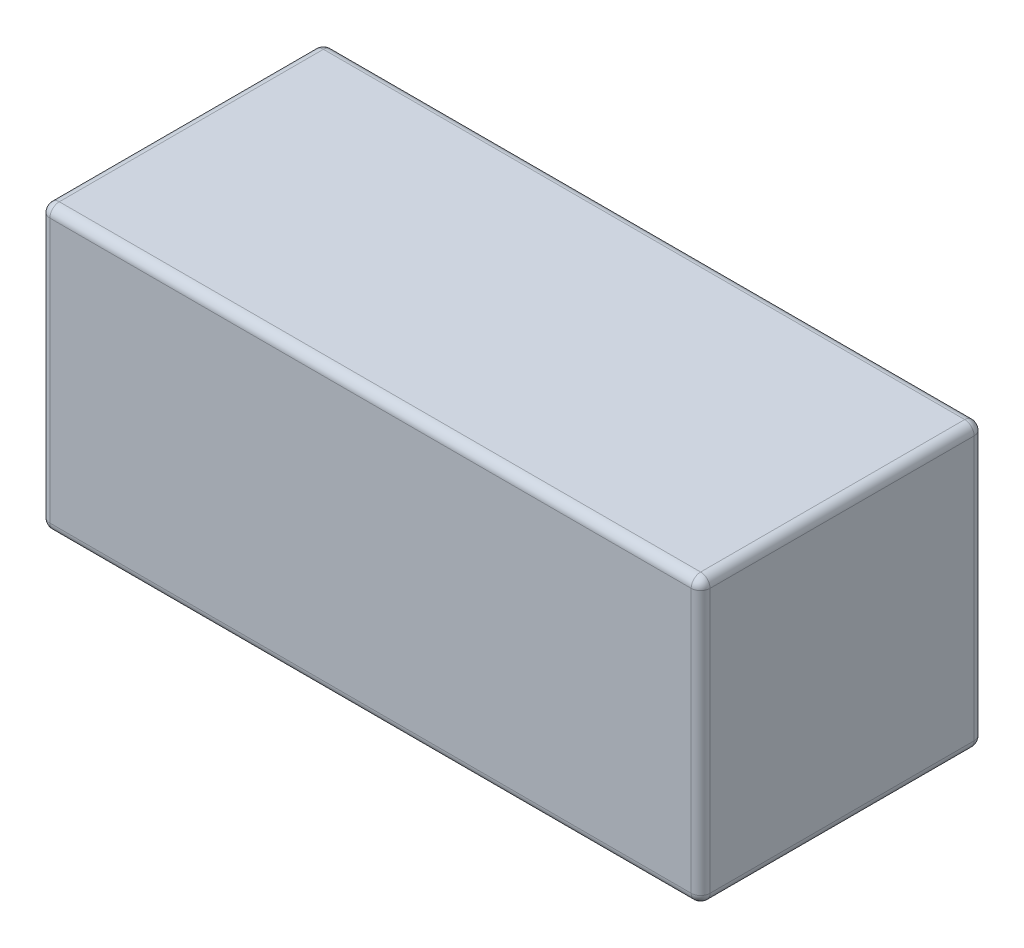
ISO-10303-21;
HEADER;
FILE_DESCRIPTION(('STEP AP214'),'2;1');
FILE_NAME('part.step','',(''),(''),'','','');
FILE_SCHEMA(('AUTOMOTIVE_DESIGN { 1 0 10303 214 1 1 1 1 }'));
ENDSEC;
DATA;
#1=APPLICATION_CONTEXT('core data for automotive mechanical design processes');
#2=APPLICATION_PROTOCOL_DEFINITION('international standard','automotive_design',2000,#1);
#3=PRODUCT_CONTEXT('',#1,'mechanical');
#4=PRODUCT('Part','Part','',(#3));
#5=PRODUCT_RELATED_PRODUCT_CATEGORY('part','',(#4));
#6=PRODUCT_DEFINITION_FORMATION('','',#4);
#7=PRODUCT_DEFINITION_CONTEXT('part definition',#1,'design');
#8=PRODUCT_DEFINITION('design','',#6,#7);
#9=PRODUCT_DEFINITION_SHAPE('','',#8);
#10=(LENGTH_UNIT() NAMED_UNIT(*) SI_UNIT(.MILLI.,.METRE.));
#11=(NAMED_UNIT(*) PLANE_ANGLE_UNIT() SI_UNIT($,.RADIAN.));
#12=(NAMED_UNIT(*) SI_UNIT($,.STERADIAN.) SOLID_ANGLE_UNIT());
#13=UNCERTAINTY_MEASURE_WITH_UNIT(LENGTH_MEASURE(1.E-05),#10,'distance_accuracy_value','');
#14=(GEOMETRIC_REPRESENTATION_CONTEXT(3) GLOBAL_UNCERTAINTY_ASSIGNED_CONTEXT((#13)) GLOBAL_UNIT_ASSIGNED_CONTEXT((#10,
#11,#12)) REPRESENTATION_CONTEXT('',''));
#15=CARTESIAN_POINT('',(0.,0.,0.));
#16=DIRECTION('',(0.,0.,1.));
#17=DIRECTION('',(1.,0.,0.));
#18=AXIS2_PLACEMENT_3D('',#15,#16,#17);
#19=CARTESIAN_POINT('',(-31.3876146788991,30.,-16.3761467889908));
#20=DIRECTION('',(1.,0.,0.));
#21=DIRECTION('',(0.,0.,-1.));
#22=AXIS2_PLACEMENT_3D('',#19,#20,#21);
#23=PLANE('',#22);
#24=DIRECTION('',(0.,0.,1.));
#25=VECTOR('',#24,1.);
#26=CARTESIAN_POINT('',(-31.3876146788991,29.,-16.3761467889908));
#27=LINE('',#26,#25);
#28=CARTESIAN_POINT('',(-31.3876146788991,29.,12.6238532110092));
#29=VERTEX_POINT('',#28);
#30=CARTESIAN_POINT('',(-31.3876146788991,29.,-15.3761467889908));
#31=VERTEX_POINT('',#30);
#32=EDGE_CURVE('E124',#29,#31,#27,.F.);
#33=ORIENTED_EDGE('',*,*,#32,.T.);
#34=DIRECTION('',(0.,-1.,0.));
#35=VECTOR('',#34,1.);
#36=CARTESIAN_POINT('',(-31.3876146788991,30.,-15.3761467889908));
#37=LINE('',#36,#35);
#38=CARTESIAN_POINT('',(-31.3876146788991,1.,-15.3761467889908));
#39=VERTEX_POINT('',#38);
#40=EDGE_CURVE('E160',#31,#39,#37,.T.);
#41=ORIENTED_EDGE('',*,*,#40,.T.);
#42=DIRECTION('',(0.,0.,1.));
#43=VECTOR('',#42,1.);
#44=CARTESIAN_POINT('',(-31.3876146788991,1.,-16.3761467889908));
#45=LINE('',#44,#43);
#46=CARTESIAN_POINT('',(-31.3876146788991,1.,12.6238532110092));
#47=VERTEX_POINT('',#46);
#48=EDGE_CURVE('E127',#39,#47,#45,.T.);
#49=ORIENTED_EDGE('',*,*,#48,.T.);
#50=DIRECTION('',(0.,-1.,0.));
#51=VECTOR('',#50,1.);
#52=CARTESIAN_POINT('',(-31.3876146788991,30.,12.6238532110092));
#53=LINE('',#52,#51);
#54=EDGE_CURVE('E120',#47,#29,#53,.F.);
#55=ORIENTED_EDGE('',*,*,#54,.T.);
#56=EDGE_LOOP('',(#33,#41,#49,#55));
#57=FACE_BOUND('',#56,.T.);
#58=ADVANCED_FACE('F32',(#57),#23,.F.);
#59=CARTESIAN_POINT('',(-31.3876146788991,30.,13.6238532110092));
#60=DIRECTION('',(0.,0.,-1.));
#61=DIRECTION('',(-1.,0.,0.));
#62=AXIS2_PLACEMENT_3D('',#59,#60,#61);
#63=PLANE('',#62);
#64=DIRECTION('',(0.,-1.,0.));
#65=VECTOR('',#64,1.);
#66=CARTESIAN_POINT('',(-30.3876146788991,30.,13.6238532110092));
#67=LINE('',#66,#65);
#68=CARTESIAN_POINT('',(-30.3876146788991,29.,13.6238532110092));
#69=VERTEX_POINT('',#68);
#70=CARTESIAN_POINT('',(-30.3876146788991,1.,13.6238532110092));
#71=VERTEX_POINT('',#70);
#72=EDGE_CURVE('E137',#69,#71,#67,.T.);
#73=ORIENTED_EDGE('',*,*,#72,.T.);
#74=DIRECTION('',(1.,0.,0.));
#75=VECTOR('',#74,1.);
#76=CARTESIAN_POINT('',(-31.3876146788991,1.,13.6238532110092));
#77=LINE('',#76,#75);
#78=CARTESIAN_POINT('',(37.6123853211009,1.,13.6238532110092));
#79=VERTEX_POINT('',#78);
#80=EDGE_CURVE('E194',#71,#79,#77,.T.);
#81=ORIENTED_EDGE('',*,*,#80,.T.);
#82=DIRECTION('',(0.,-1.,0.));
#83=VECTOR('',#82,1.);
#84=CARTESIAN_POINT('',(37.6123853211009,30.,13.6238532110092));
#85=LINE('',#84,#83);
#86=CARTESIAN_POINT('',(37.6123853211009,29.,13.6238532110092));
#87=VERTEX_POINT('',#86);
#88=EDGE_CURVE('E192',#79,#87,#85,.F.);
#89=ORIENTED_EDGE('',*,*,#88,.T.);
#90=DIRECTION('',(1.,0.,0.));
#91=VECTOR('',#90,1.);
#92=CARTESIAN_POINT('',(-31.3876146788991,29.,13.6238532110092));
#93=LINE('',#92,#91);
#94=EDGE_CURVE('E189',#87,#69,#93,.F.);
#95=ORIENTED_EDGE('',*,*,#94,.T.);
#96=EDGE_LOOP('',(#73,#81,#89,#95));
#97=FACE_BOUND('',#96,.T.);
#98=ADVANCED_FACE('F262',(#97),#63,.F.);
#99=CARTESIAN_POINT('',(38.6123853211009,30.,-16.3761467889908));
#100=DIRECTION('',(-1.,0.,0.));
#101=DIRECTION('',(0.,0.,1.));
#102=AXIS2_PLACEMENT_3D('',#99,#100,#101);
#103=PLANE('',#102);
#104=DIRECTION('',(0.,0.,-1.));
#105=VECTOR('',#104,1.);
#106=CARTESIAN_POINT('',(38.6123853211009,1.,-16.3761467889908));
#107=LINE('',#106,#105);
#108=CARTESIAN_POINT('',(38.6123853211009,1.,12.6238532110092));
#109=VERTEX_POINT('',#108);
#110=CARTESIAN_POINT('',(38.6123853211009,1.,-15.3761467889908));
#111=VERTEX_POINT('',#110);
#112=EDGE_CURVE('E184',#109,#111,#107,.T.);
#113=ORIENTED_EDGE('',*,*,#112,.T.);
#114=DIRECTION('',(0.,-1.,0.));
#115=VECTOR('',#114,1.);
#116=CARTESIAN_POINT('',(38.6123853211009,30.,-15.3761467889908));
#117=LINE('',#116,#115);
#118=CARTESIAN_POINT('',(38.6123853211009,29.,-15.3761467889908));
#119=VERTEX_POINT('',#118);
#120=EDGE_CURVE('E187',#111,#119,#117,.F.);
#121=ORIENTED_EDGE('',*,*,#120,.T.);
#122=DIRECTION('',(0.,0.,-1.));
#123=VECTOR('',#122,1.);
#124=CARTESIAN_POINT('',(38.6123853211009,29.,13.6238532110092));
#125=LINE('',#124,#123);
#126=CARTESIAN_POINT('',(38.6123853211009,29.,12.6238532110092));
#127=VERTEX_POINT('',#126);
#128=EDGE_CURVE('E182',#119,#127,#125,.F.);
#129=ORIENTED_EDGE('',*,*,#128,.T.);
#130=DIRECTION('',(0.,-1.,0.));
#131=VECTOR('',#130,1.);
#132=CARTESIAN_POINT('',(38.6123853211009,30.,12.6238532110092));
#133=LINE('',#132,#131);
#134=EDGE_CURVE('E180',#127,#109,#133,.T.);
#135=ORIENTED_EDGE('',*,*,#134,.T.);
#136=EDGE_LOOP('',(#113,#121,#129,#135));
#137=FACE_BOUND('',#136,.T.);
#138=ADVANCED_FACE('F291',(#137),#103,.F.);
#139=CARTESIAN_POINT('',(-31.3876146788991,30.,-16.3761467889908));
#140=DIRECTION('',(0.,0.,1.));
#141=DIRECTION('',(1.,0.,0.));
#142=AXIS2_PLACEMENT_3D('',#139,#140,#141);
#143=PLANE('',#142);
#144=DIRECTION('',(-1.,0.,0.));
#145=VECTOR('',#144,1.);
#146=CARTESIAN_POINT('',(-31.3876146788991,1.,-16.3761467889908));
#147=LINE('',#146,#145);
#148=CARTESIAN_POINT('',(37.6123853211009,1.,-16.3761467889908));
#149=VERTEX_POINT('',#148);
#150=CARTESIAN_POINT('',(-30.3876146788991,1.,-16.3761467889908));
#151=VERTEX_POINT('',#150);
#152=EDGE_CURVE('E166',#149,#151,#147,.T.);
#153=ORIENTED_EDGE('',*,*,#152,.T.);
#154=DIRECTION('',(0.,-1.,0.));
#155=VECTOR('',#154,1.);
#156=CARTESIAN_POINT('',(-30.3876146788991,30.,-16.3761467889908));
#157=LINE('',#156,#155);
#158=CARTESIAN_POINT('',(-30.3876146788991,29.,-16.3761467889908));
#159=VERTEX_POINT('',#158);
#160=EDGE_CURVE('E168',#151,#159,#157,.F.);
#161=ORIENTED_EDGE('',*,*,#160,.T.);
#162=DIRECTION('',(-1.,0.,0.));
#163=VECTOR('',#162,1.);
#164=CARTESIAN_POINT('',(38.6123853211009,29.,-16.3761467889908));
#165=LINE('',#164,#163);
#166=CARTESIAN_POINT('',(37.6123853211009,29.,-16.3761467889908));
#167=VERTEX_POINT('',#166);
#168=EDGE_CURVE('E162',#159,#167,#165,.F.);
#169=ORIENTED_EDGE('',*,*,#168,.T.);
#170=DIRECTION('',(0.,-1.,0.));
#171=VECTOR('',#170,1.);
#172=CARTESIAN_POINT('',(37.6123853211009,30.,-16.3761467889908));
#173=LINE('',#172,#171);
#174=EDGE_CURVE('E164',#167,#149,#173,.T.);
#175=ORIENTED_EDGE('',*,*,#174,.T.);
#176=EDGE_LOOP('',(#153,#161,#169,#175));
#177=FACE_BOUND('',#176,.T.);
#178=ADVANCED_FACE('F491',(#177),#143,.F.);
#179=CARTESIAN_POINT('',(0.,30.,0.));
#180=DIRECTION('',(0.,1.,0.));
#181=DIRECTION('',(0.,0.,1.));
#182=AXIS2_PLACEMENT_3D('',#179,#180,#181);
#183=PLANE('',#182);
#184=DIRECTION('',(1.,0.,0.));
#185=VECTOR('',#184,1.);
#186=CARTESIAN_POINT('',(38.6123853211009,30.,12.6238532110092));
#187=LINE('',#186,#185);
#188=CARTESIAN_POINT('',(-30.3876146788991,30.,12.6238532110092));
#189=VERTEX_POINT('',#188);
#190=CARTESIAN_POINT('',(37.6123853211009,30.,12.6238532110092));
#191=VERTEX_POINT('',#190);
#192=EDGE_CURVE('E197',#189,#191,#187,.T.);
#193=ORIENTED_EDGE('',*,*,#192,.T.);
#194=DIRECTION('',(0.,0.,-1.));
#195=VECTOR('',#194,1.);
#196=CARTESIAN_POINT('',(37.6123853211009,30.,-16.3761467889908));
#197=LINE('',#196,#195);
#198=CARTESIAN_POINT('',(37.6123853211009,30.,-15.3761467889908));
#199=VERTEX_POINT('',#198);
#200=EDGE_CURVE('E11',#191,#199,#197,.T.);
#201=ORIENTED_EDGE('',*,*,#200,.T.);
#202=DIRECTION('',(-1.,0.,0.));
#203=VECTOR('',#202,1.);
#204=CARTESIAN_POINT('',(-31.3876146788991,30.,-15.3761467889908));
#205=LINE('',#204,#203);
#206=CARTESIAN_POINT('',(-30.3876146788991,30.,-15.3761467889908));
#207=VERTEX_POINT('',#206);
#208=EDGE_CURVE('E41',#199,#207,#205,.T.);
#209=ORIENTED_EDGE('',*,*,#208,.T.);
#210=DIRECTION('',(0.,0.,1.));
#211=VECTOR('',#210,1.);
#212=CARTESIAN_POINT('',(-30.3876146788991,30.,13.6238532110092));
#213=LINE('',#212,#211);
#214=EDGE_CURVE('E199',#207,#189,#213,.T.);
#215=ORIENTED_EDGE('',*,*,#214,.T.);
#216=EDGE_LOOP('',(#193,#201,#209,#215));
#217=FACE_BOUND('',#216,.T.);
#218=ADVANCED_FACE('F302',(#217),#183,.T.);
#219=CARTESIAN_POINT('',(0.,0.,0.));
#220=DIRECTION('',(0.,1.,0.));
#221=DIRECTION('',(0.,0.,1.));
#222=AXIS2_PLACEMENT_3D('',#219,#220,#221);
#223=PLANE('',#222);
#224=DIRECTION('',(0.,0.,1.));
#225=VECTOR('',#224,1.);
#226=CARTESIAN_POINT('',(-30.3876146788991,0.,0.));
#227=LINE('',#226,#225);
#228=CARTESIAN_POINT('',(-30.3876146788991,0.,12.6238532110092));
#229=VERTEX_POINT('',#228);
#230=CARTESIAN_POINT('',(-30.3876146788991,0.,-15.3761467889908));
#231=VERTEX_POINT('',#230);
#232=EDGE_CURVE('E173',#229,#231,#227,.F.);
#233=ORIENTED_EDGE('',*,*,#232,.T.);
#234=DIRECTION('',(-1.,0.,0.));
#235=VECTOR('',#234,1.);
#236=CARTESIAN_POINT('',(0.,0.,-15.3761467889908));
#237=LINE('',#236,#235);
#238=CARTESIAN_POINT('',(37.6123853211009,0.,-15.3761467889908));
#239=VERTEX_POINT('',#238);
#240=EDGE_CURVE('E177',#231,#239,#237,.F.);
#241=ORIENTED_EDGE('',*,*,#240,.T.);
#242=DIRECTION('',(0.,0.,-1.));
#243=VECTOR('',#242,1.);
#244=CARTESIAN_POINT('',(37.6123853211009,0.,0.));
#245=LINE('',#244,#243);
#246=CARTESIAN_POINT('',(37.6123853211009,0.,12.6238532110092));
#247=VERTEX_POINT('',#246);
#248=EDGE_CURVE('E175',#239,#247,#245,.F.);
#249=ORIENTED_EDGE('',*,*,#248,.T.);
#250=DIRECTION('',(1.,0.,0.));
#251=VECTOR('',#250,1.);
#252=CARTESIAN_POINT('',(0.,0.,12.6238532110092));
#253=LINE('',#252,#251);
#254=EDGE_CURVE('E171',#247,#229,#253,.F.);
#255=ORIENTED_EDGE('',*,*,#254,.T.);
#256=EDGE_LOOP('',(#233,#241,#249,#255));
#257=FACE_BOUND('',#256,.T.);
#258=ADVANCED_FACE('F275',(#257),#223,.F.);
#259=CARTESIAN_POINT('',(37.6123853211009,30.,12.6238532110092));
#260=DIRECTION('',(0.,-1.,0.));
#261=DIRECTION('',(0.,0.,-1.));
#262=AXIS2_PLACEMENT_3D('',#259,#260,#261);
#263=CYLINDRICAL_SURFACE('',#262,1.);
#264=CARTESIAN_POINT('',(37.6123853211009,29.,12.6238532110092));
#265=DIRECTION('',(0.,1.,0.));
#266=DIRECTION('',(0.,0.,1.));
#267=AXIS2_PLACEMENT_3D('',#264,#265,#266);
#268=CIRCLE('',#267,1.);
#269=EDGE_CURVE('E36',#87,#127,#268,.T.);
#270=ORIENTED_EDGE('',*,*,#269,.F.);
#271=ORIENTED_EDGE('',*,*,#88,.F.);
#272=CARTESIAN_POINT('',(37.6123853211009,1.,12.6238532110092));
#273=DIRECTION('',(0.,-1.,0.));
#274=DIRECTION('',(0.,0.,-1.));
#275=AXIS2_PLACEMENT_3D('',#272,#273,#274);
#276=CIRCLE('',#275,1.);
#277=EDGE_CURVE('E157',#109,#79,#276,.T.);
#278=ORIENTED_EDGE('',*,*,#277,.F.);
#279=ORIENTED_EDGE('',*,*,#134,.F.);
#280=EDGE_LOOP('',(#270,#271,#278,#279));
#281=FACE_BOUND('',#280,.T.);
#282=ADVANCED_FACE('F34',(#281),#263,.T.);
#283=CARTESIAN_POINT('',(37.6123853211009,29.,12.6238532110092));
#284=DIRECTION('',(0.,0.,1.));
#285=DIRECTION('',(1.,0.,0.));
#286=AXIS2_PLACEMENT_3D('',#283,#284,#285);
#287=SPHERICAL_SURFACE('',#286,1.);
#288=CARTESIAN_POINT('',(37.6123853211009,29.,12.6238532110092));
#289=DIRECTION('',(1.,0.,0.));
#290=DIRECTION('',(0.,0.,-1.));
#291=AXIS2_PLACEMENT_3D('',#288,#289,#290);
#292=CIRCLE('',#291,1.);
#293=EDGE_CURVE('E242',#87,#191,#292,.F.);
#294=ORIENTED_EDGE('',*,*,#293,.F.);
#295=ORIENTED_EDGE('',*,*,#269,.T.);
#296=CARTESIAN_POINT('',(37.6123853211009,29.,12.6238532110092));
#297=DIRECTION('',(0.,0.,1.));
#298=DIRECTION('',(1.,0.,0.));
#299=AXIS2_PLACEMENT_3D('',#296,#297,#298);
#300=CIRCLE('',#299,1.);
#301=EDGE_CURVE('E245',#191,#127,#300,.F.);
#302=ORIENTED_EDGE('',*,*,#301,.F.);
#303=EDGE_LOOP('',(#294,#295,#302));
#304=FACE_BOUND('',#303,.T.);
#305=ADVANCED_FACE('F295',(#304),#287,.T.);
#306=CARTESIAN_POINT('',(37.6123853211009,1.,12.6238532110092));
#307=DIRECTION('',(0.,0.,1.));
#308=DIRECTION('',(1.,0.,0.));
#309=AXIS2_PLACEMENT_3D('',#306,#307,#308);
#310=SPHERICAL_SURFACE('',#309,1.);
#311=CARTESIAN_POINT('',(37.6123853211009,1.,12.6238532110092));
#312=DIRECTION('',(0.,0.,1.));
#313=DIRECTION('',(1.,0.,0.));
#314=AXIS2_PLACEMENT_3D('',#311,#312,#313);
#315=CIRCLE('',#314,1.);
#316=EDGE_CURVE('E237',#109,#247,#315,.F.);
#317=ORIENTED_EDGE('',*,*,#316,.F.);
#318=ORIENTED_EDGE('',*,*,#277,.T.);
#319=CARTESIAN_POINT('',(37.6123853211009,1.,12.6238532110092));
#320=DIRECTION('',(1.,0.,0.));
#321=DIRECTION('',(0.,0.,-1.));
#322=AXIS2_PLACEMENT_3D('',#319,#320,#321);
#323=CIRCLE('',#322,1.);
#324=EDGE_CURVE('E240',#247,#79,#323,.F.);
#325=ORIENTED_EDGE('',*,*,#324,.F.);
#326=EDGE_LOOP('',(#317,#318,#325));
#327=FACE_BOUND('',#326,.T.);
#328=ADVANCED_FACE('F253',(#327),#310,.T.);
#329=CARTESIAN_POINT('',(37.6123853211009,29.,0.));
#330=DIRECTION('',(0.,0.,1.));
#331=DIRECTION('',(1.,0.,0.));
#332=AXIS2_PLACEMENT_3D('',#329,#330,#331);
#333=CYLINDRICAL_SURFACE('',#332,1.);
#334=ORIENTED_EDGE('',*,*,#301,.T.);
#335=ORIENTED_EDGE('',*,*,#128,.F.);
#336=CARTESIAN_POINT('',(37.6123853211009,29.,-15.3761467889908));
#337=DIRECTION('',(0.,0.,-1.));
#338=DIRECTION('',(-1.,0.,0.));
#339=AXIS2_PLACEMENT_3D('',#336,#337,#338);
#340=CIRCLE('',#339,1.);
#341=EDGE_CURVE('E231',#199,#119,#340,.T.);
#342=ORIENTED_EDGE('',*,*,#341,.F.);
#343=ORIENTED_EDGE('',*,*,#200,.F.);
#344=EDGE_LOOP('',(#334,#335,#342,#343));
#345=FACE_BOUND('',#344,.T.);
#346=ADVANCED_FACE('F299',(#345),#333,.T.);
#347=CARTESIAN_POINT('',(0.,29.,12.6238532110092));
#348=DIRECTION('',(-1.,0.,0.));
#349=DIRECTION('',(0.,0.,1.));
#350=AXIS2_PLACEMENT_3D('',#347,#348,#349);
#351=CYLINDRICAL_SURFACE('',#350,1.);
#352=ORIENTED_EDGE('',*,*,#293,.T.);
#353=ORIENTED_EDGE('',*,*,#192,.F.);
#354=CARTESIAN_POINT('',(-30.3876146788991,29.,12.6238532110092));
#355=DIRECTION('',(-1.,0.,0.));
#356=DIRECTION('',(0.,0.,1.));
#357=AXIS2_PLACEMENT_3D('',#354,#355,#356);
#358=CIRCLE('',#357,1.);
#359=EDGE_CURVE('E141',#69,#189,#358,.T.);
#360=ORIENTED_EDGE('',*,*,#359,.F.);
#361=ORIENTED_EDGE('',*,*,#94,.F.);
#362=EDGE_LOOP('',(#352,#353,#360,#361));
#363=FACE_BOUND('',#362,.T.);
#364=ADVANCED_FACE('F305',(#363),#351,.T.);
#365=CARTESIAN_POINT('',(-30.3876146788991,30.,12.6238532110092));
#366=DIRECTION('',(0.,-1.,0.));
#367=DIRECTION('',(0.,0.,-1.));
#368=AXIS2_PLACEMENT_3D('',#365,#366,#367);
#369=CYLINDRICAL_SURFACE('',#368,1.);
#370=CARTESIAN_POINT('',(-30.3876146788991,1.,12.6238532110092));
#371=DIRECTION('',(0.,-1.,0.));
#372=DIRECTION('',(0.,0.,-1.));
#373=AXIS2_PLACEMENT_3D('',#370,#371,#372);
#374=CIRCLE('',#373,1.);
#375=EDGE_CURVE('E142',#71,#47,#374,.T.);
#376=ORIENTED_EDGE('',*,*,#375,.F.);
#377=ORIENTED_EDGE('',*,*,#72,.F.);
#378=CARTESIAN_POINT('',(-30.3876146788991,29.,12.6238532110092));
#379=DIRECTION('',(0.,1.,0.));
#380=DIRECTION('',(0.,0.,1.));
#381=AXIS2_PLACEMENT_3D('',#378,#379,#380);
#382=CIRCLE('',#381,1.);
#383=EDGE_CURVE('E134',#29,#69,#382,.T.);
#384=ORIENTED_EDGE('',*,*,#383,.F.);
#385=ORIENTED_EDGE('',*,*,#54,.F.);
#386=EDGE_LOOP('',(#376,#377,#384,#385));
#387=FACE_BOUND('',#386,.T.);
#388=ADVANCED_FACE('F136',(#387),#369,.T.);
#389=CARTESIAN_POINT('',(-31.3876146788991,1.,12.6238532110092));
#390=DIRECTION('',(1.,0.,0.));
#391=DIRECTION('',(0.,0.,-1.));
#392=AXIS2_PLACEMENT_3D('',#389,#390,#391);
#393=CYLINDRICAL_SURFACE('',#392,1.);
#394=ORIENTED_EDGE('',*,*,#324,.T.);
#395=ORIENTED_EDGE('',*,*,#80,.F.);
#396=CARTESIAN_POINT('',(-30.3876146788991,1.,12.6238532110092));
#397=DIRECTION('',(-1.,0.,0.));
#398=DIRECTION('',(0.,0.,1.));
#399=AXIS2_PLACEMENT_3D('',#396,#397,#398);
#400=CIRCLE('',#399,1.);
#401=EDGE_CURVE('E226',#229,#71,#400,.T.);
#402=ORIENTED_EDGE('',*,*,#401,.F.);
#403=ORIENTED_EDGE('',*,*,#254,.F.);
#404=EDGE_LOOP('',(#394,#395,#402,#403));
#405=FACE_BOUND('',#404,.T.);
#406=ADVANCED_FACE('F265',(#405),#393,.T.);
#407=CARTESIAN_POINT('',(37.6123853211009,1.,-16.3761467889908));
#408=DIRECTION('',(0.,0.,-1.));
#409=DIRECTION('',(-1.,0.,0.));
#410=AXIS2_PLACEMENT_3D('',#407,#408,#409);
#411=CYLINDRICAL_SURFACE('',#410,1.);
#412=ORIENTED_EDGE('',*,*,#316,.T.);
#413=ORIENTED_EDGE('',*,*,#248,.F.);
#414=CARTESIAN_POINT('',(37.6123853211009,1.,-15.3761467889908));
#415=DIRECTION('',(0.,0.,-1.));
#416=DIRECTION('',(-1.,0.,0.));
#417=AXIS2_PLACEMENT_3D('',#414,#415,#416);
#418=CIRCLE('',#417,1.);
#419=EDGE_CURVE('E223',#111,#239,#418,.T.);
#420=ORIENTED_EDGE('',*,*,#419,.F.);
#421=ORIENTED_EDGE('',*,*,#112,.F.);
#422=EDGE_LOOP('',(#412,#413,#420,#421));
#423=FACE_BOUND('',#422,.T.);
#424=ADVANCED_FACE('F289',(#423),#411,.T.);
#425=CARTESIAN_POINT('',(37.6123853211009,30.,-15.3761467889908));
#426=DIRECTION('',(0.,-1.,0.));
#427=DIRECTION('',(0.,0.,-1.));
#428=AXIS2_PLACEMENT_3D('',#425,#426,#427);
#429=CYLINDRICAL_SURFACE('',#428,1.);
#430=CARTESIAN_POINT('',(37.6123853211009,29.,-15.3761467889908));
#431=DIRECTION('',(0.,1.,0.));
#432=DIRECTION('',(0.,0.,1.));
#433=AXIS2_PLACEMENT_3D('',#430,#431,#432);
#434=CIRCLE('',#433,1.);
#435=EDGE_CURVE('E234',#119,#167,#434,.T.);
#436=ORIENTED_EDGE('',*,*,#435,.F.);
#437=ORIENTED_EDGE('',*,*,#120,.F.);
#438=CARTESIAN_POINT('',(37.6123853211009,1.,-15.3761467889908));
#439=DIRECTION('',(0.,-1.,0.));
#440=DIRECTION('',(0.,0.,-1.));
#441=AXIS2_PLACEMENT_3D('',#438,#439,#440);
#442=CIRCLE('',#441,1.);
#443=EDGE_CURVE('E221',#149,#111,#442,.T.);
#444=ORIENTED_EDGE('',*,*,#443,.F.);
#445=ORIENTED_EDGE('',*,*,#174,.F.);
#446=EDGE_LOOP('',(#436,#437,#444,#445));
#447=FACE_BOUND('',#446,.T.);
#448=ADVANCED_FACE('F352',(#447),#429,.T.);
#449=CARTESIAN_POINT('',(37.6123853211009,29.,-15.3761467889908));
#450=DIRECTION('',(0.,0.,1.));
#451=DIRECTION('',(1.,0.,0.));
#452=AXIS2_PLACEMENT_3D('',#449,#450,#451);
#453=SPHERICAL_SURFACE('',#452,1.);
#454=ORIENTED_EDGE('',*,*,#341,.T.);
#455=ORIENTED_EDGE('',*,*,#435,.T.);
#456=CARTESIAN_POINT('',(37.6123853211009,29.,-15.3761467889908));
#457=DIRECTION('',(1.,0.,0.));
#458=DIRECTION('',(0.,1.,0.));
#459=AXIS2_PLACEMENT_3D('',#456,#457,#458);
#460=CIRCLE('',#459,1.);
#461=EDGE_CURVE('E148',#199,#167,#460,.F.);
#462=ORIENTED_EDGE('',*,*,#461,.F.);
#463=EDGE_LOOP('',(#454,#455,#462));
#464=FACE_BOUND('',#463,.T.);
#465=ADVANCED_FACE('F349',(#464),#453,.T.);
#466=CARTESIAN_POINT('',(-30.3876146788991,29.,12.6238532110092));
#467=DIRECTION('',(0.,0.,1.));
#468=DIRECTION('',(1.,0.,0.));
#469=AXIS2_PLACEMENT_3D('',#466,#467,#468);
#470=SPHERICAL_SURFACE('',#469,1.);
#471=ORIENTED_EDGE('',*,*,#383,.T.);
#472=ORIENTED_EDGE('',*,*,#359,.T.);
#473=CARTESIAN_POINT('',(-30.3876146788991,29.,12.6238532110092));
#474=DIRECTION('',(0.,0.,1.));
#475=DIRECTION('',(1.,0.,0.));
#476=AXIS2_PLACEMENT_3D('',#473,#474,#475);
#477=CIRCLE('',#476,1.);
#478=EDGE_CURVE('E145',#29,#189,#477,.F.);
#479=ORIENTED_EDGE('',*,*,#478,.F.);
#480=EDGE_LOOP('',(#471,#472,#479));
#481=FACE_BOUND('',#480,.T.);
#482=ADVANCED_FACE('F146',(#481),#470,.T.);
#483=CARTESIAN_POINT('',(-30.3876146788991,1.,12.6238532110092));
#484=DIRECTION('',(0.,0.,1.));
#485=DIRECTION('',(1.,0.,0.));
#486=AXIS2_PLACEMENT_3D('',#483,#484,#485);
#487=SPHERICAL_SURFACE('',#486,1.);
#488=ORIENTED_EDGE('',*,*,#401,.T.);
#489=ORIENTED_EDGE('',*,*,#375,.T.);
#490=CARTESIAN_POINT('',(-30.3876146788991,1.,12.6238532110092));
#491=DIRECTION('',(0.,0.,1.));
#492=DIRECTION('',(1.,0.,0.));
#493=AXIS2_PLACEMENT_3D('',#490,#491,#492);
#494=CIRCLE('',#493,1.);
#495=EDGE_CURVE('E149',#229,#47,#494,.F.);
#496=ORIENTED_EDGE('',*,*,#495,.F.);
#497=EDGE_LOOP('',(#488,#489,#496));
#498=FACE_BOUND('',#497,.T.);
#499=ADVANCED_FACE('F268',(#498),#487,.T.);
#500=CARTESIAN_POINT('',(37.6123853211009,1.,-15.3761467889908));
#501=DIRECTION('',(0.,0.,1.));
#502=DIRECTION('',(1.,0.,0.));
#503=AXIS2_PLACEMENT_3D('',#500,#501,#502);
#504=SPHERICAL_SURFACE('',#503,1.);
#505=ORIENTED_EDGE('',*,*,#443,.T.);
#506=ORIENTED_EDGE('',*,*,#419,.T.);
#507=CARTESIAN_POINT('',(37.6123853211009,1.,-15.3761467889908));
#508=DIRECTION('',(1.,0.,0.));
#509=DIRECTION('',(0.,0.,-1.));
#510=AXIS2_PLACEMENT_3D('',#507,#508,#509);
#511=CIRCLE('',#510,1.);
#512=EDGE_CURVE('E216',#149,#239,#511,.F.);
#513=ORIENTED_EDGE('',*,*,#512,.F.);
#514=EDGE_LOOP('',(#505,#506,#513));
#515=FACE_BOUND('',#514,.T.);
#516=ADVANCED_FACE('F285',(#515),#504,.T.);
#517=CARTESIAN_POINT('',(0.,29.,-15.3761467889908));
#518=DIRECTION('',(1.,0.,0.));
#519=DIRECTION('',(0.,0.,-1.));
#520=AXIS2_PLACEMENT_3D('',#517,#518,#519);
#521=CYLINDRICAL_SURFACE('',#520,1.);
#522=ORIENTED_EDGE('',*,*,#461,.T.);
#523=ORIENTED_EDGE('',*,*,#168,.F.);
#524=CARTESIAN_POINT('',(-30.3876146788991,29.,-15.3761467889908));
#525=DIRECTION('',(-1.,0.,0.));
#526=DIRECTION('',(0.,0.,1.));
#527=AXIS2_PLACEMENT_3D('',#524,#525,#526);
#528=CIRCLE('',#527,1.);
#529=EDGE_CURVE('E213',#207,#159,#528,.T.);
#530=ORIENTED_EDGE('',*,*,#529,.F.);
#531=ORIENTED_EDGE('',*,*,#208,.F.);
#532=EDGE_LOOP('',(#522,#523,#530,#531));
#533=FACE_BOUND('',#532,.T.);
#534=ADVANCED_FACE('F340',(#533),#521,.T.);
#535=CARTESIAN_POINT('',(-30.3876146788991,29.,0.));
#536=DIRECTION('',(0.,0.,-1.));
#537=DIRECTION('',(-1.,0.,0.));
#538=AXIS2_PLACEMENT_3D('',#535,#536,#537);
#539=CYLINDRICAL_SURFACE('',#538,1.);
#540=ORIENTED_EDGE('',*,*,#478,.T.);
#541=ORIENTED_EDGE('',*,*,#214,.F.);
#542=CARTESIAN_POINT('',(-30.3876146788991,29.,-15.3761467889908));
#543=DIRECTION('',(0.,0.,-1.));
#544=DIRECTION('',(-1.,0.,0.));
#545=AXIS2_PLACEMENT_3D('',#542,#543,#544);
#546=CIRCLE('',#545,1.);
#547=EDGE_CURVE('E153',#31,#207,#546,.T.);
#548=ORIENTED_EDGE('',*,*,#547,.F.);
#549=ORIENTED_EDGE('',*,*,#32,.F.);
#550=EDGE_LOOP('',(#540,#541,#548,#549));
#551=FACE_BOUND('',#550,.T.);
#552=ADVANCED_FACE('F151',(#551),#539,.T.);
#553=CARTESIAN_POINT('',(-30.3876146788991,1.,-16.3761467889908));
#554=DIRECTION('',(0.,0.,1.));
#555=DIRECTION('',(1.,0.,0.));
#556=AXIS2_PLACEMENT_3D('',#553,#554,#555);
#557=CYLINDRICAL_SURFACE('',#556,1.);
#558=ORIENTED_EDGE('',*,*,#495,.T.);
#559=ORIENTED_EDGE('',*,*,#48,.F.);
#560=CARTESIAN_POINT('',(-30.3876146788991,1.,-15.3761467889908));
#561=DIRECTION('',(0.,0.,-1.));
#562=DIRECTION('',(-1.,0.,0.));
#563=AXIS2_PLACEMENT_3D('',#560,#561,#562);
#564=CIRCLE('',#563,1.);
#565=EDGE_CURVE('E209',#231,#39,#564,.T.);
#566=ORIENTED_EDGE('',*,*,#565,.F.);
#567=ORIENTED_EDGE('',*,*,#232,.F.);
#568=EDGE_LOOP('',(#558,#559,#566,#567));
#569=FACE_BOUND('',#568,.T.);
#570=ADVANCED_FACE('F272',(#569),#557,.T.);
#571=CARTESIAN_POINT('',(-31.3876146788991,1.,-15.3761467889908));
#572=DIRECTION('',(-1.,0.,0.));
#573=DIRECTION('',(0.,0.,1.));
#574=AXIS2_PLACEMENT_3D('',#571,#572,#573);
#575=CYLINDRICAL_SURFACE('',#574,1.);
#576=ORIENTED_EDGE('',*,*,#512,.T.);
#577=ORIENTED_EDGE('',*,*,#240,.F.);
#578=CARTESIAN_POINT('',(-30.3876146788991,1.,-15.3761467889908));
#579=DIRECTION('',(-1.,0.,0.));
#580=DIRECTION('',(0.,0.,1.));
#581=AXIS2_PLACEMENT_3D('',#578,#579,#580);
#582=CIRCLE('',#581,1.);
#583=EDGE_CURVE('E206',#151,#231,#582,.T.);
#584=ORIENTED_EDGE('',*,*,#583,.F.);
#585=ORIENTED_EDGE('',*,*,#152,.F.);
#586=EDGE_LOOP('',(#576,#577,#584,#585));
#587=FACE_BOUND('',#586,.T.);
#588=ADVANCED_FACE('F278',(#587),#575,.T.);
#589=CARTESIAN_POINT('',(-30.3876146788991,29.,-15.3761467889908));
#590=DIRECTION('',(0.,0.,1.));
#591=DIRECTION('',(1.,0.,0.));
#592=AXIS2_PLACEMENT_3D('',#589,#590,#591);
#593=SPHERICAL_SURFACE('',#592,1.);
#594=ORIENTED_EDGE('',*,*,#547,.T.);
#595=ORIENTED_EDGE('',*,*,#529,.T.);
#596=CARTESIAN_POINT('',(-30.3876146788991,29.,-15.3761467889908));
#597=DIRECTION('',(0.,1.,0.));
#598=DIRECTION('',(0.,0.,1.));
#599=AXIS2_PLACEMENT_3D('',#596,#597,#598);
#600=CIRCLE('',#599,1.);
#601=EDGE_CURVE('E204',#31,#159,#600,.F.);
#602=ORIENTED_EDGE('',*,*,#601,.F.);
#603=EDGE_LOOP('',(#594,#595,#602));
#604=FACE_BOUND('',#603,.T.);
#605=ADVANCED_FACE('F329',(#604),#593,.T.);
#606=CARTESIAN_POINT('',(-30.3876146788991,1.,-15.3761467889908));
#607=DIRECTION('',(0.,0.,1.));
#608=DIRECTION('',(1.,0.,0.));
#609=AXIS2_PLACEMENT_3D('',#606,#607,#608);
#610=SPHERICAL_SURFACE('',#609,1.);
#611=ORIENTED_EDGE('',*,*,#583,.T.);
#612=ORIENTED_EDGE('',*,*,#565,.T.);
#613=CARTESIAN_POINT('',(-30.3876146788991,1.,-15.3761467889908));
#614=DIRECTION('',(0.,-1.,0.));
#615=DIRECTION('',(0.,0.,-1.));
#616=AXIS2_PLACEMENT_3D('',#613,#614,#615);
#617=CIRCLE('',#616,1.);
#618=EDGE_CURVE('E202',#151,#39,#617,.F.);
#619=ORIENTED_EDGE('',*,*,#618,.F.);
#620=EDGE_LOOP('',(#611,#612,#619));
#621=FACE_BOUND('',#620,.T.);
#622=ADVANCED_FACE('F325',(#621),#610,.T.);
#623=CARTESIAN_POINT('',(-30.3876146788991,30.,-15.3761467889908));
#624=DIRECTION('',(0.,-1.,0.));
#625=DIRECTION('',(0.,0.,-1.));
#626=AXIS2_PLACEMENT_3D('',#623,#624,#625);
#627=CYLINDRICAL_SURFACE('',#626,1.);
#628=ORIENTED_EDGE('',*,*,#601,.T.);
#629=ORIENTED_EDGE('',*,*,#160,.F.);
#630=ORIENTED_EDGE('',*,*,#618,.T.);
#631=ORIENTED_EDGE('',*,*,#40,.F.);
#632=EDGE_LOOP('',(#628,#629,#630,#631));
#633=FACE_BOUND('',#632,.T.);
#634=ADVANCED_FACE('F322',(#633),#627,.T.);
#635=CLOSED_SHELL('',(#58,#98,#138,#178,#218,#258,#282,#305,#328,#346,#364,#388,#406,#424,#448,
#465,#482,#499,#516,#534,#552,#570,#588,#605,#622,#634));
#636=MANIFOLD_SOLID_BREP('B2',#635);
#637=ADVANCED_BREP_SHAPE_REPRESENTATION('',(#18,#636),#14);
#638=SHAPE_DEFINITION_REPRESENTATION(#9,#637);
ENDSEC;
END-ISO-10303-21;
